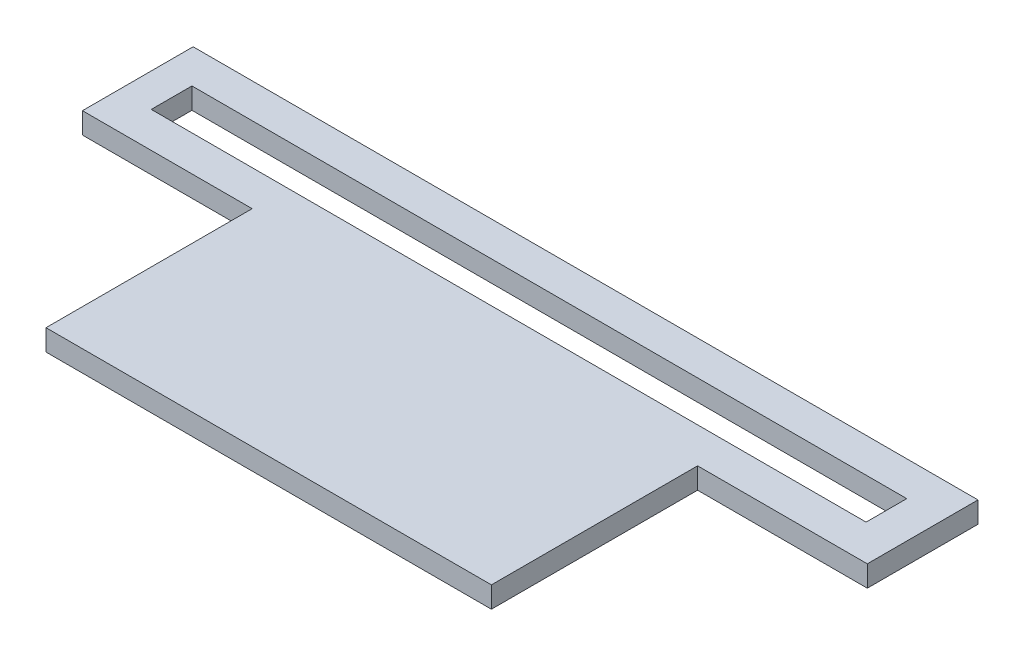
ISO-10303-21;
HEADER;
FILE_DESCRIPTION(('STEP AP214'),'2;1');
FILE_NAME('part.step','',(''),(''),'','','');
FILE_SCHEMA(('AUTOMOTIVE_DESIGN { 1 0 10303 214 1 1 1 1 }'));
ENDSEC;
DATA;
#1=APPLICATION_CONTEXT('core data for automotive mechanical design processes');
#2=APPLICATION_PROTOCOL_DEFINITION('international standard','automotive_design',2000,#1);
#3=PRODUCT_CONTEXT('',#1,'mechanical');
#4=PRODUCT('Part','Part','',(#3));
#5=PRODUCT_RELATED_PRODUCT_CATEGORY('part','',(#4));
#6=PRODUCT_DEFINITION_FORMATION('','',#4);
#7=PRODUCT_DEFINITION_CONTEXT('part definition',#1,'design');
#8=PRODUCT_DEFINITION('design','',#6,#7);
#9=PRODUCT_DEFINITION_SHAPE('','',#8);
#10=(LENGTH_UNIT() NAMED_UNIT(*) SI_UNIT(.MILLI.,.METRE.));
#11=(NAMED_UNIT(*) PLANE_ANGLE_UNIT() SI_UNIT($,.RADIAN.));
#12=(NAMED_UNIT(*) SI_UNIT($,.STERADIAN.) SOLID_ANGLE_UNIT());
#13=UNCERTAINTY_MEASURE_WITH_UNIT(LENGTH_MEASURE(1.E-05),#10,'distance_accuracy_value','');
#14=(GEOMETRIC_REPRESENTATION_CONTEXT(3) GLOBAL_UNCERTAINTY_ASSIGNED_CONTEXT((#13)) GLOBAL_UNIT_ASSIGNED_CONTEXT((#10,
#11,#12)) REPRESENTATION_CONTEXT('',''));
#15=CARTESIAN_POINT('',(0.,0.,0.));
#16=DIRECTION('',(0.,0.,1.));
#17=DIRECTION('',(1.,0.,0.));
#18=AXIS2_PLACEMENT_3D('',#15,#16,#17);
#19=CARTESIAN_POINT('',(0.,1.87,0.));
#20=DIRECTION('',(0.,1.,0.));
#21=DIRECTION('',(0.,0.,1.));
#22=AXIS2_PLACEMENT_3D('',#19,#20,#21);
#23=PLANE('',#22);
#24=DIRECTION('',(1.,0.,0.));
#25=VECTOR('',#24,1.);
#26=CARTESIAN_POINT('',(-19.5647478590025,1.87,0.0440256554838949));
#27=LINE('',#26,#25);
#28=CARTESIAN_POINT('',(-19.5647478590025,1.87,0.0440256554838949));
#29=VERTEX_POINT('',#28);
#30=CARTESIAN_POINT('',(19.8652521409975,1.87,0.0440256554838949));
#31=VERTEX_POINT('',#30);
#32=EDGE_CURVE('E164',#29,#31,#27,.T.);
#33=ORIENTED_EDGE('',*,*,#32,.T.);
#34=DIRECTION('',(0.,0.,-1.));
#35=VECTOR('',#34,1.);
#36=CARTESIAN_POINT('',(19.8652521409975,1.87,0.0440256554838949));
#37=LINE('',#36,#35);
#38=CARTESIAN_POINT('',(19.8652521409975,1.87,-18.2059743445161));
#39=VERTEX_POINT('',#38);
#40=EDGE_CURVE('E167',#31,#39,#37,.T.);
#41=ORIENTED_EDGE('',*,*,#40,.T.);
#42=DIRECTION('',(1.,0.,0.));
#43=VECTOR('',#42,1.);
#44=CARTESIAN_POINT('',(19.8652521409975,1.87,-18.2059743445161));
#45=LINE('',#44,#43);
#46=CARTESIAN_POINT('',(34.8902521409975,1.87,-18.2059743445161));
#47=VERTEX_POINT('',#46);
#48=EDGE_CURVE('E170',#39,#47,#45,.T.);
#49=ORIENTED_EDGE('',*,*,#48,.T.);
#50=DIRECTION('',(0.,0.,-1.));
#51=VECTOR('',#50,1.);
#52=CARTESIAN_POINT('',(34.8902521409975,1.87,-28.0059743445161));
#53=LINE('',#52,#51);
#54=CARTESIAN_POINT('',(34.8902521409975,1.87,-28.0059743445161));
#55=VERTEX_POINT('',#54);
#56=EDGE_CURVE('E172',#47,#55,#53,.T.);
#57=ORIENTED_EDGE('',*,*,#56,.T.);
#58=DIRECTION('',(-1.,0.,0.));
#59=VECTOR('',#58,1.);
#60=CARTESIAN_POINT('',(-34.5897478590025,1.87,-28.0059743445161));
#61=LINE('',#60,#59);
#62=CARTESIAN_POINT('',(-34.5897478590025,1.87,-28.0059743445161));
#63=VERTEX_POINT('',#62);
#64=EDGE_CURVE('E174',#55,#63,#61,.T.);
#65=ORIENTED_EDGE('',*,*,#64,.T.);
#66=DIRECTION('',(0.,0.,1.));
#67=VECTOR('',#66,1.);
#68=CARTESIAN_POINT('',(-34.5897478590025,1.87,-18.2059743445161));
#69=LINE('',#68,#67);
#70=CARTESIAN_POINT('',(-34.5897478590025,1.87,-18.2059743445161));
#71=VERTEX_POINT('',#70);
#72=EDGE_CURVE('E176',#63,#71,#69,.T.);
#73=ORIENTED_EDGE('',*,*,#72,.T.);
#74=DIRECTION('',(1.,0.,0.));
#75=VECTOR('',#74,1.);
#76=CARTESIAN_POINT('',(-34.5897478590025,1.87,-18.2059743445161));
#77=LINE('',#76,#75);
#78=CARTESIAN_POINT('',(-19.5647478590025,1.87,-18.2059743445161));
#79=VERTEX_POINT('',#78);
#80=EDGE_CURVE('E178',#71,#79,#77,.T.);
#81=ORIENTED_EDGE('',*,*,#80,.T.);
#82=DIRECTION('',(0.,0.,1.));
#83=VECTOR('',#82,1.);
#84=CARTESIAN_POINT('',(-19.5647478590025,1.87,0.0440256554838949));
#85=LINE('',#84,#83);
#86=EDGE_CURVE('E180',#79,#29,#85,.T.);
#87=ORIENTED_EDGE('',*,*,#86,.T.);
#88=EDGE_LOOP('',(#33,#41,#49,#57,#65,#73,#81,#87));
#89=FACE_BOUND('',#88,.T.);
#90=DIRECTION('',(0.,0.,-1.));
#91=VECTOR('',#90,1.);
#92=CARTESIAN_POINT('',(31.64,1.87,-24.95));
#93=LINE('',#92,#91);
#94=CARTESIAN_POINT('',(31.64,1.87,-21.35));
#95=VERTEX_POINT('',#94);
#96=CARTESIAN_POINT('',(31.64,1.87,-24.95));
#97=VERTEX_POINT('',#96);
#98=EDGE_CURVE('E136',#95,#97,#93,.T.);
#99=ORIENTED_EDGE('',*,*,#98,.F.);
#100=DIRECTION('',(1.,0.,0.));
#101=VECTOR('',#100,1.);
#102=CARTESIAN_POINT('',(-31.64,1.87,-21.35));
#103=LINE('',#102,#101);
#104=CARTESIAN_POINT('',(-31.64,1.87,-21.35));
#105=VERTEX_POINT('',#104);
#106=EDGE_CURVE('E128',#105,#95,#103,.T.);
#107=ORIENTED_EDGE('',*,*,#106,.F.);
#108=DIRECTION('',(0.,0.,1.));
#109=VECTOR('',#108,1.);
#110=CARTESIAN_POINT('',(-31.64,1.87,-24.95));
#111=LINE('',#110,#109);
#112=CARTESIAN_POINT('',(-31.64,1.87,-24.95));
#113=VERTEX_POINT('',#112);
#114=EDGE_CURVE('E150',#113,#105,#111,.T.);
#115=ORIENTED_EDGE('',*,*,#114,.F.);
#116=DIRECTION('',(-1.,0.,0.));
#117=VECTOR('',#116,1.);
#118=CARTESIAN_POINT('',(-31.64,1.87,-24.95));
#119=LINE('',#118,#117);
#120=EDGE_CURVE('E148',#97,#113,#119,.T.);
#121=ORIENTED_EDGE('',*,*,#120,.F.);
#122=EDGE_LOOP('',(#99,#107,#115,#121));
#123=FACE_BOUND('',#122,.T.);
#124=ADVANCED_FACE('F39',(#89,#123),#23,.T.);
#125=CARTESIAN_POINT('',(0.,0.,0.));
#126=DIRECTION('',(0.,1.,0.));
#127=DIRECTION('',(0.,0.,1.));
#128=AXIS2_PLACEMENT_3D('',#125,#126,#127);
#129=PLANE('',#128);
#130=DIRECTION('',(1.,0.,0.));
#131=VECTOR('',#130,1.);
#132=CARTESIAN_POINT('',(-19.5647478590025,0.,0.0440256554838949));
#133=LINE('',#132,#131);
#134=CARTESIAN_POINT('',(-19.5647478590025,0.,0.0440256554838949));
#135=VERTEX_POINT('',#134);
#136=CARTESIAN_POINT('',(19.8652521409975,0.,0.0440256554838949));
#137=VERTEX_POINT('',#136);
#138=EDGE_CURVE('E144',#135,#137,#133,.T.);
#139=ORIENTED_EDGE('',*,*,#138,.F.);
#140=DIRECTION('',(0.,0.,1.));
#141=VECTOR('',#140,1.);
#142=CARTESIAN_POINT('',(-19.5647478590025,0.,0.0440256554838949));
#143=LINE('',#142,#141);
#144=CARTESIAN_POINT('',(-19.5647478590025,0.,-18.2059743445161));
#145=VERTEX_POINT('',#144);
#146=EDGE_CURVE('E168',#145,#135,#143,.T.);
#147=ORIENTED_EDGE('',*,*,#146,.F.);
#148=DIRECTION('',(1.,0.,0.));
#149=VECTOR('',#148,1.);
#150=CARTESIAN_POINT('',(-34.5897478590025,0.,-18.2059743445161));
#151=LINE('',#150,#149);
#152=CARTESIAN_POINT('',(-34.5897478590025,0.,-18.2059743445161));
#153=VERTEX_POINT('',#152);
#154=EDGE_CURVE('E195',#153,#145,#151,.T.);
#155=ORIENTED_EDGE('',*,*,#154,.F.);
#156=DIRECTION('',(0.,0.,1.));
#157=VECTOR('',#156,1.);
#158=CARTESIAN_POINT('',(-34.5897478590025,0.,-18.2059743445161));
#159=LINE('',#158,#157);
#160=CARTESIAN_POINT('',(-34.5897478590025,0.,-28.0059743445161));
#161=VERTEX_POINT('',#160);
#162=EDGE_CURVE('E193',#161,#153,#159,.T.);
#163=ORIENTED_EDGE('',*,*,#162,.F.);
#164=DIRECTION('',(-1.,0.,0.));
#165=VECTOR('',#164,1.);
#166=CARTESIAN_POINT('',(-34.5897478590025,0.,-28.0059743445161));
#167=LINE('',#166,#165);
#168=CARTESIAN_POINT('',(34.8902521409975,0.,-28.0059743445161));
#169=VERTEX_POINT('',#168);
#170=EDGE_CURVE('E191',#169,#161,#167,.T.);
#171=ORIENTED_EDGE('',*,*,#170,.F.);
#172=DIRECTION('',(0.,0.,-1.));
#173=VECTOR('',#172,1.);
#174=CARTESIAN_POINT('',(34.8902521409975,0.,-28.0059743445161));
#175=LINE('',#174,#173);
#176=CARTESIAN_POINT('',(34.8902521409975,0.,-18.2059743445161));
#177=VERTEX_POINT('',#176);
#178=EDGE_CURVE('E189',#177,#169,#175,.T.);
#179=ORIENTED_EDGE('',*,*,#178,.F.);
#180=DIRECTION('',(1.,0.,0.));
#181=VECTOR('',#180,1.);
#182=CARTESIAN_POINT('',(19.8652521409975,0.,-18.2059743445161));
#183=LINE('',#182,#181);
#184=CARTESIAN_POINT('',(19.8652521409975,0.,-18.2059743445161));
#185=VERTEX_POINT('',#184);
#186=EDGE_CURVE('E187',#185,#177,#183,.T.);
#187=ORIENTED_EDGE('',*,*,#186,.F.);
#188=DIRECTION('',(0.,0.,-1.));
#189=VECTOR('',#188,1.);
#190=CARTESIAN_POINT('',(19.8652521409975,0.,0.0440256554838949));
#191=LINE('',#190,#189);
#192=EDGE_CURVE('E185',#137,#185,#191,.T.);
#193=ORIENTED_EDGE('',*,*,#192,.F.);
#194=EDGE_LOOP('',(#139,#147,#155,#163,#171,#179,#187,#193));
#195=FACE_BOUND('',#194,.T.);
#196=DIRECTION('',(1.,0.,0.));
#197=VECTOR('',#196,1.);
#198=CARTESIAN_POINT('',(-31.64,0.,-21.35));
#199=LINE('',#198,#197);
#200=CARTESIAN_POINT('',(-31.64,0.,-21.35));
#201=VERTEX_POINT('',#200);
#202=CARTESIAN_POINT('',(31.64,0.,-21.35));
#203=VERTEX_POINT('',#202);
#204=EDGE_CURVE('E62',#201,#203,#199,.T.);
#205=ORIENTED_EDGE('',*,*,#204,.T.);
#206=DIRECTION('',(0.,0.,-1.));
#207=VECTOR('',#206,1.);
#208=CARTESIAN_POINT('',(31.64,0.,-24.95));
#209=LINE('',#208,#207);
#210=CARTESIAN_POINT('',(31.64,0.,-24.95));
#211=VERTEX_POINT('',#210);
#212=EDGE_CURVE('E143',#203,#211,#209,.T.);
#213=ORIENTED_EDGE('',*,*,#212,.T.);
#214=DIRECTION('',(-1.,0.,0.));
#215=VECTOR('',#214,1.);
#216=CARTESIAN_POINT('',(-31.64,0.,-24.95));
#217=LINE('',#216,#215);
#218=CARTESIAN_POINT('',(-31.64,0.,-24.95));
#219=VERTEX_POINT('',#218);
#220=EDGE_CURVE('E156',#211,#219,#217,.T.);
#221=ORIENTED_EDGE('',*,*,#220,.T.);
#222=DIRECTION('',(0.,0.,1.));
#223=VECTOR('',#222,1.);
#224=CARTESIAN_POINT('',(-31.64,0.,-24.95));
#225=LINE('',#224,#223);
#226=EDGE_CURVE('E137',#219,#201,#225,.T.);
#227=ORIENTED_EDGE('',*,*,#226,.T.);
#228=EDGE_LOOP('',(#205,#213,#221,#227));
#229=FACE_BOUND('',#228,.T.);
#230=ADVANCED_FACE('F225',(#195,#229),#129,.F.);
#231=CARTESIAN_POINT('',(-19.5647478590025,1.87,0.0440256554838949));
#232=DIRECTION('',(0.,0.,-1.));
#233=DIRECTION('',(-1.,0.,0.));
#234=AXIS2_PLACEMENT_3D('',#231,#232,#233);
#235=PLANE('',#234);
#236=ORIENTED_EDGE('',*,*,#138,.T.);
#237=DIRECTION('',(0.,-1.,0.));
#238=VECTOR('',#237,1.);
#239=CARTESIAN_POINT('',(19.8652521409975,1.87,0.0440256554838949));
#240=LINE('',#239,#238);
#241=EDGE_CURVE('E11',#31,#137,#240,.T.);
#242=ORIENTED_EDGE('',*,*,#241,.F.);
#243=ORIENTED_EDGE('',*,*,#32,.F.);
#244=DIRECTION('',(0.,-1.,0.));
#245=VECTOR('',#244,1.);
#246=CARTESIAN_POINT('',(-19.5647478590025,1.87,0.0440256554838949));
#247=LINE('',#246,#245);
#248=EDGE_CURVE('E182',#29,#135,#247,.T.);
#249=ORIENTED_EDGE('',*,*,#248,.T.);
#250=EDGE_LOOP('',(#236,#242,#243,#249));
#251=FACE_BOUND('',#250,.T.);
#252=ADVANCED_FACE('F41',(#251),#235,.F.);
#253=CARTESIAN_POINT('',(19.8652521409975,1.87,0.0440256554838949));
#254=DIRECTION('',(-1.,0.,0.));
#255=DIRECTION('',(0.,0.,1.));
#256=AXIS2_PLACEMENT_3D('',#253,#254,#255);
#257=PLANE('',#256);
#258=ORIENTED_EDGE('',*,*,#192,.T.);
#259=DIRECTION('',(0.,-1.,0.));
#260=VECTOR('',#259,1.);
#261=CARTESIAN_POINT('',(19.8652521409975,1.87,-18.2059743445161));
#262=LINE('',#261,#260);
#263=EDGE_CURVE('E47',#39,#185,#262,.T.);
#264=ORIENTED_EDGE('',*,*,#263,.F.);
#265=ORIENTED_EDGE('',*,*,#40,.F.);
#266=ORIENTED_EDGE('',*,*,#241,.T.);
#267=EDGE_LOOP('',(#258,#264,#265,#266));
#268=FACE_BOUND('',#267,.T.);
#269=ADVANCED_FACE('F242',(#268),#257,.F.);
#270=CARTESIAN_POINT('',(19.8652521409975,1.87,-18.2059743445161));
#271=DIRECTION('',(0.,0.,-1.));
#272=DIRECTION('',(-1.,0.,0.));
#273=AXIS2_PLACEMENT_3D('',#270,#271,#272);
#274=PLANE('',#273);
#275=ORIENTED_EDGE('',*,*,#186,.T.);
#276=DIRECTION('',(0.,-1.,0.));
#277=VECTOR('',#276,1.);
#278=CARTESIAN_POINT('',(34.8902521409975,1.87,-18.2059743445161));
#279=LINE('',#278,#277);
#280=EDGE_CURVE('E212',#47,#177,#279,.T.);
#281=ORIENTED_EDGE('',*,*,#280,.F.);
#282=ORIENTED_EDGE('',*,*,#48,.F.);
#283=ORIENTED_EDGE('',*,*,#263,.T.);
#284=EDGE_LOOP('',(#275,#281,#282,#283));
#285=FACE_BOUND('',#284,.T.);
#286=ADVANCED_FACE('F219',(#285),#274,.F.);
#287=CARTESIAN_POINT('',(34.8902521409975,1.87,-28.0059743445161));
#288=DIRECTION('',(-1.,0.,0.));
#289=DIRECTION('',(0.,0.,1.));
#290=AXIS2_PLACEMENT_3D('',#287,#288,#289);
#291=PLANE('',#290);
#292=ORIENTED_EDGE('',*,*,#178,.T.);
#293=DIRECTION('',(0.,-1.,0.));
#294=VECTOR('',#293,1.);
#295=CARTESIAN_POINT('',(34.8902521409975,1.87,-28.0059743445161));
#296=LINE('',#295,#294);
#297=EDGE_CURVE('E209',#55,#169,#296,.T.);
#298=ORIENTED_EDGE('',*,*,#297,.F.);
#299=ORIENTED_EDGE('',*,*,#56,.F.);
#300=ORIENTED_EDGE('',*,*,#280,.T.);
#301=EDGE_LOOP('',(#292,#298,#299,#300));
#302=FACE_BOUND('',#301,.T.);
#303=ADVANCED_FACE('F231',(#302),#291,.F.);
#304=CARTESIAN_POINT('',(-34.5897478590025,1.87,-28.0059743445161));
#305=DIRECTION('',(0.,0.,1.));
#306=DIRECTION('',(1.,0.,0.));
#307=AXIS2_PLACEMENT_3D('',#304,#305,#306);
#308=PLANE('',#307);
#309=ORIENTED_EDGE('',*,*,#170,.T.);
#310=DIRECTION('',(0.,-1.,0.));
#311=VECTOR('',#310,1.);
#312=CARTESIAN_POINT('',(-34.5897478590025,1.87,-28.0059743445161));
#313=LINE('',#312,#311);
#314=EDGE_CURVE('E206',#63,#161,#313,.T.);
#315=ORIENTED_EDGE('',*,*,#314,.F.);
#316=ORIENTED_EDGE('',*,*,#64,.F.);
#317=ORIENTED_EDGE('',*,*,#297,.T.);
#318=EDGE_LOOP('',(#309,#315,#316,#317));
#319=FACE_BOUND('',#318,.T.);
#320=ADVANCED_FACE('F235',(#319),#308,.F.);
#321=CARTESIAN_POINT('',(-34.5897478590025,1.87,-18.2059743445161));
#322=DIRECTION('',(1.,0.,0.));
#323=DIRECTION('',(0.,0.,-1.));
#324=AXIS2_PLACEMENT_3D('',#321,#322,#323);
#325=PLANE('',#324);
#326=ORIENTED_EDGE('',*,*,#162,.T.);
#327=DIRECTION('',(0.,-1.,0.));
#328=VECTOR('',#327,1.);
#329=CARTESIAN_POINT('',(-34.5897478590025,1.87,-18.2059743445161));
#330=LINE('',#329,#328);
#331=EDGE_CURVE('E203',#71,#153,#330,.T.);
#332=ORIENTED_EDGE('',*,*,#331,.F.);
#333=ORIENTED_EDGE('',*,*,#72,.F.);
#334=ORIENTED_EDGE('',*,*,#314,.T.);
#335=EDGE_LOOP('',(#326,#332,#333,#334));
#336=FACE_BOUND('',#335,.T.);
#337=ADVANCED_FACE('F255',(#336),#325,.F.);
#338=CARTESIAN_POINT('',(-34.5897478590025,1.87,-18.2059743445161));
#339=DIRECTION('',(0.,0.,-1.));
#340=DIRECTION('',(-1.,0.,0.));
#341=AXIS2_PLACEMENT_3D('',#338,#339,#340);
#342=PLANE('',#341);
#343=ORIENTED_EDGE('',*,*,#154,.T.);
#344=DIRECTION('',(0.,-1.,0.));
#345=VECTOR('',#344,1.);
#346=CARTESIAN_POINT('',(-19.5647478590025,1.87,-18.2059743445161));
#347=LINE('',#346,#345);
#348=EDGE_CURVE('E200',#79,#145,#347,.T.);
#349=ORIENTED_EDGE('',*,*,#348,.F.);
#350=ORIENTED_EDGE('',*,*,#80,.F.);
#351=ORIENTED_EDGE('',*,*,#331,.T.);
#352=EDGE_LOOP('',(#343,#349,#350,#351));
#353=FACE_BOUND('',#352,.T.);
#354=ADVANCED_FACE('F253',(#353),#342,.F.);
#355=CARTESIAN_POINT('',(-19.5647478590025,1.87,0.0440256554838949));
#356=DIRECTION('',(1.,0.,0.));
#357=DIRECTION('',(0.,0.,-1.));
#358=AXIS2_PLACEMENT_3D('',#355,#356,#357);
#359=PLANE('',#358);
#360=ORIENTED_EDGE('',*,*,#146,.T.);
#361=ORIENTED_EDGE('',*,*,#248,.F.);
#362=ORIENTED_EDGE('',*,*,#86,.F.);
#363=ORIENTED_EDGE('',*,*,#348,.T.);
#364=EDGE_LOOP('',(#360,#361,#362,#363));
#365=FACE_BOUND('',#364,.T.);
#366=ADVANCED_FACE('F248',(#365),#359,.F.);
#367=CARTESIAN_POINT('',(-31.64,1.87,-21.35));
#368=DIRECTION('',(0.,0.,-1.));
#369=DIRECTION('',(-1.,0.,0.));
#370=AXIS2_PLACEMENT_3D('',#367,#368,#369);
#371=PLANE('',#370);
#372=ORIENTED_EDGE('',*,*,#204,.F.);
#373=DIRECTION('',(0.,-1.,0.));
#374=VECTOR('',#373,1.);
#375=CARTESIAN_POINT('',(-31.64,1.87,-21.35));
#376=LINE('',#375,#374);
#377=EDGE_CURVE('E132',#105,#201,#376,.T.);
#378=ORIENTED_EDGE('',*,*,#377,.F.);
#379=ORIENTED_EDGE('',*,*,#106,.T.);
#380=DIRECTION('',(0.,-1.,0.));
#381=VECTOR('',#380,1.);
#382=CARTESIAN_POINT('',(31.64,1.87,-21.35));
#383=LINE('',#382,#381);
#384=EDGE_CURVE('E131',#95,#203,#383,.T.);
#385=ORIENTED_EDGE('',*,*,#384,.T.);
#386=EDGE_LOOP('',(#372,#378,#379,#385));
#387=FACE_BOUND('',#386,.T.);
#388=ADVANCED_FACE('F130',(#387),#371,.T.);
#389=CARTESIAN_POINT('',(31.64,1.87,-24.95));
#390=DIRECTION('',(-1.,0.,0.));
#391=DIRECTION('',(0.,0.,1.));
#392=AXIS2_PLACEMENT_3D('',#389,#390,#391);
#393=PLANE('',#392);
#394=ORIENTED_EDGE('',*,*,#212,.F.);
#395=ORIENTED_EDGE('',*,*,#384,.F.);
#396=ORIENTED_EDGE('',*,*,#98,.T.);
#397=DIRECTION('',(0.,-1.,0.));
#398=VECTOR('',#397,1.);
#399=CARTESIAN_POINT('',(31.64,1.87,-24.95));
#400=LINE('',#399,#398);
#401=EDGE_CURVE('E145',#97,#211,#400,.T.);
#402=ORIENTED_EDGE('',*,*,#401,.T.);
#403=EDGE_LOOP('',(#394,#395,#396,#402));
#404=FACE_BOUND('',#403,.T.);
#405=ADVANCED_FACE('F140',(#404),#393,.T.);
#406=CARTESIAN_POINT('',(-31.64,1.87,-24.95));
#407=DIRECTION('',(0.,0.,1.));
#408=DIRECTION('',(1.,0.,0.));
#409=AXIS2_PLACEMENT_3D('',#406,#407,#408);
#410=PLANE('',#409);
#411=ORIENTED_EDGE('',*,*,#220,.F.);
#412=ORIENTED_EDGE('',*,*,#401,.F.);
#413=ORIENTED_EDGE('',*,*,#120,.T.);
#414=DIRECTION('',(0.,-1.,0.));
#415=VECTOR('',#414,1.);
#416=CARTESIAN_POINT('',(-31.64,1.87,-24.95));
#417=LINE('',#416,#415);
#418=EDGE_CURVE('E54',#113,#219,#417,.T.);
#419=ORIENTED_EDGE('',*,*,#418,.T.);
#420=EDGE_LOOP('',(#411,#412,#413,#419));
#421=FACE_BOUND('',#420,.T.);
#422=ADVANCED_FACE('F280',(#421),#410,.T.);
#423=CARTESIAN_POINT('',(-31.64,1.87,-24.95));
#424=DIRECTION('',(1.,0.,0.));
#425=DIRECTION('',(0.,0.,-1.));
#426=AXIS2_PLACEMENT_3D('',#423,#424,#425);
#427=PLANE('',#426);
#428=ORIENTED_EDGE('',*,*,#226,.F.);
#429=ORIENTED_EDGE('',*,*,#418,.F.);
#430=ORIENTED_EDGE('',*,*,#114,.T.);
#431=ORIENTED_EDGE('',*,*,#377,.T.);
#432=EDGE_LOOP('',(#428,#429,#430,#431));
#433=FACE_BOUND('',#432,.T.);
#434=ADVANCED_FACE('F284',(#433),#427,.T.);
#435=CLOSED_SHELL('',(#124,#230,#252,#269,#286,#303,#320,#337,#354,#366,#388,#405,#422,#434));
#436=MANIFOLD_SOLID_BREP('B2',#435);
#437=ADVANCED_BREP_SHAPE_REPRESENTATION('',(#18,#436),#14);
#438=SHAPE_DEFINITION_REPRESENTATION(#9,#437);
ENDSEC;
END-ISO-10303-21;
